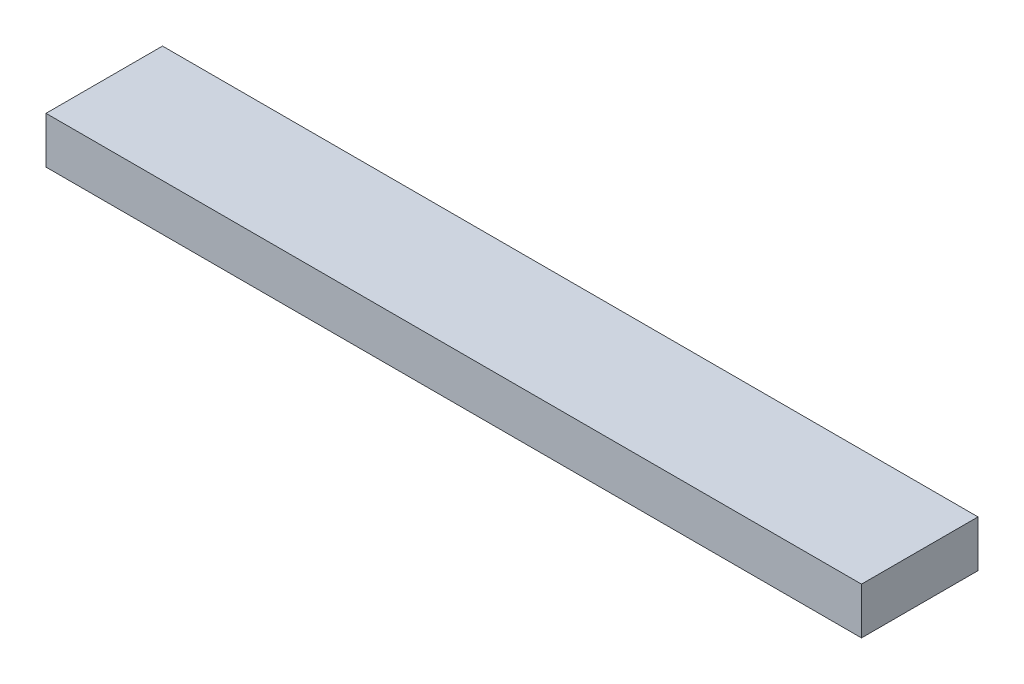
ISO-10303-21;
HEADER;
FILE_DESCRIPTION(('STEP AP214'),'2;1');
FILE_NAME('part.step','',(''),(''),'','','');
FILE_SCHEMA(('AUTOMOTIVE_DESIGN { 1 0 10303 214 1 1 1 1 }'));
ENDSEC;
DATA;
#1=APPLICATION_CONTEXT('core data for automotive mechanical design processes');
#2=APPLICATION_PROTOCOL_DEFINITION('international standard','automotive_design',2000,#1);
#3=PRODUCT_CONTEXT('',#1,'mechanical');
#4=PRODUCT('Part','Part','',(#3));
#5=PRODUCT_RELATED_PRODUCT_CATEGORY('part','',(#4));
#6=PRODUCT_DEFINITION_FORMATION('','',#4);
#7=PRODUCT_DEFINITION_CONTEXT('part definition',#1,'design');
#8=PRODUCT_DEFINITION('design','',#6,#7);
#9=PRODUCT_DEFINITION_SHAPE('','',#8);
#10=(LENGTH_UNIT() NAMED_UNIT(*) SI_UNIT(.MILLI.,.METRE.));
#11=(NAMED_UNIT(*) PLANE_ANGLE_UNIT() SI_UNIT($,.RADIAN.));
#12=(NAMED_UNIT(*) SI_UNIT($,.STERADIAN.) SOLID_ANGLE_UNIT());
#13=UNCERTAINTY_MEASURE_WITH_UNIT(LENGTH_MEASURE(1.E-05),#10,'distance_accuracy_value','');
#14=(GEOMETRIC_REPRESENTATION_CONTEXT(3) GLOBAL_UNCERTAINTY_ASSIGNED_CONTEXT((#13)) GLOBAL_UNIT_ASSIGNED_CONTEXT((#10,
#11,#12)) REPRESENTATION_CONTEXT('',''));
#15=CARTESIAN_POINT('',(0.,0.,0.));
#16=DIRECTION('',(0.,0.,1.));
#17=DIRECTION('',(1.,0.,0.));
#18=AXIS2_PLACEMENT_3D('',#15,#16,#17);
#19=CARTESIAN_POINT('',(175.,10.,-25.));
#20=DIRECTION('',(-1.,0.,0.));
#21=DIRECTION('',(0.,0.,1.));
#22=AXIS2_PLACEMENT_3D('',#19,#20,#21);
#23=PLANE('',#22);
#24=DIRECTION('',(0.,0.,-1.));
#25=VECTOR('',#24,1.);
#26=CARTESIAN_POINT('',(175.,-10.,-25.));
#27=LINE('',#26,#25);
#28=CARTESIAN_POINT('',(175.,-10.,25.));
#29=VERTEX_POINT('',#28);
#30=CARTESIAN_POINT('',(175.,-10.,-25.));
#31=VERTEX_POINT('',#30);
#32=EDGE_CURVE('E107',#29,#31,#27,.T.);
#33=ORIENTED_EDGE('',*,*,#32,.T.);
#34=DIRECTION('',(0.,-1.,0.));
#35=VECTOR('',#34,1.);
#36=CARTESIAN_POINT('',(175.,10.,-25.));
#37=LINE('',#36,#35);
#38=CARTESIAN_POINT('',(175.,10.,-25.));
#39=VERTEX_POINT('',#38);
#40=EDGE_CURVE('E11',#39,#31,#37,.T.);
#41=ORIENTED_EDGE('',*,*,#40,.F.);
#42=DIRECTION('',(0.,0.,-1.));
#43=VECTOR('',#42,1.);
#44=CARTESIAN_POINT('',(175.,10.,-25.));
#45=LINE('',#44,#43);
#46=CARTESIAN_POINT('',(175.,10.,25.));
#47=VERTEX_POINT('',#46);
#48=EDGE_CURVE('E91',#47,#39,#45,.T.);
#49=ORIENTED_EDGE('',*,*,#48,.F.);
#50=DIRECTION('',(0.,-1.,0.));
#51=VECTOR('',#50,1.);
#52=CARTESIAN_POINT('',(175.,10.,25.));
#53=LINE('',#52,#51);
#54=EDGE_CURVE('E103',#47,#29,#53,.T.);
#55=ORIENTED_EDGE('',*,*,#54,.T.);
#56=EDGE_LOOP('',(#33,#41,#49,#55));
#57=FACE_BOUND('',#56,.T.);
#58=ADVANCED_FACE('F39',(#57),#23,.F.);
#59=CARTESIAN_POINT('',(-175.,10.,-25.));
#60=DIRECTION('',(0.,0.,1.));
#61=DIRECTION('',(1.,0.,0.));
#62=AXIS2_PLACEMENT_3D('',#59,#60,#61);
#63=PLANE('',#62);
#64=DIRECTION('',(-1.,0.,0.));
#65=VECTOR('',#64,1.);
#66=CARTESIAN_POINT('',(-175.,-10.,-25.));
#67=LINE('',#66,#65);
#68=CARTESIAN_POINT('',(-175.,-10.,-25.));
#69=VERTEX_POINT('',#68);
#70=EDGE_CURVE('E96',#31,#69,#67,.T.);
#71=ORIENTED_EDGE('',*,*,#70,.T.);
#72=DIRECTION('',(0.,-1.,0.));
#73=VECTOR('',#72,1.);
#74=CARTESIAN_POINT('',(-175.,10.,-25.));
#75=LINE('',#74,#73);
#76=CARTESIAN_POINT('',(-175.,10.,-25.));
#77=VERTEX_POINT('',#76);
#78=EDGE_CURVE('E48',#77,#69,#75,.T.);
#79=ORIENTED_EDGE('',*,*,#78,.F.);
#80=DIRECTION('',(-1.,0.,0.));
#81=VECTOR('',#80,1.);
#82=CARTESIAN_POINT('',(-175.,10.,-25.));
#83=LINE('',#82,#81);
#84=EDGE_CURVE('E86',#39,#77,#83,.T.);
#85=ORIENTED_EDGE('',*,*,#84,.F.);
#86=ORIENTED_EDGE('',*,*,#40,.T.);
#87=EDGE_LOOP('',(#71,#79,#85,#86));
#88=FACE_BOUND('',#87,.T.);
#89=ADVANCED_FACE('F95',(#88),#63,.F.);
#90=CARTESIAN_POINT('',(-175.,10.,-25.));
#91=DIRECTION('',(1.,0.,0.));
#92=DIRECTION('',(0.,0.,-1.));
#93=AXIS2_PLACEMENT_3D('',#90,#91,#92);
#94=PLANE('',#93);
#95=DIRECTION('',(0.,0.,1.));
#96=VECTOR('',#95,1.);
#97=CARTESIAN_POINT('',(-175.,-10.,-25.));
#98=LINE('',#97,#96);
#99=CARTESIAN_POINT('',(-175.,-10.,25.));
#100=VERTEX_POINT('',#99);
#101=EDGE_CURVE('E73',#69,#100,#98,.T.);
#102=ORIENTED_EDGE('',*,*,#101,.T.);
#103=DIRECTION('',(0.,-1.,0.));
#104=VECTOR('',#103,1.);
#105=CARTESIAN_POINT('',(-175.,10.,25.));
#106=LINE('',#105,#104);
#107=CARTESIAN_POINT('',(-175.,10.,25.));
#108=VERTEX_POINT('',#107);
#109=EDGE_CURVE('E98',#108,#100,#106,.T.);
#110=ORIENTED_EDGE('',*,*,#109,.F.);
#111=DIRECTION('',(0.,0.,1.));
#112=VECTOR('',#111,1.);
#113=CARTESIAN_POINT('',(-175.,10.,-25.));
#114=LINE('',#113,#112);
#115=EDGE_CURVE('E89',#77,#108,#114,.T.);
#116=ORIENTED_EDGE('',*,*,#115,.F.);
#117=ORIENTED_EDGE('',*,*,#78,.T.);
#118=EDGE_LOOP('',(#102,#110,#116,#117));
#119=FACE_BOUND('',#118,.T.);
#120=ADVANCED_FACE('F99',(#119),#94,.F.);
#121=CARTESIAN_POINT('',(-175.,10.,25.));
#122=DIRECTION('',(0.,0.,-1.));
#123=DIRECTION('',(-1.,0.,0.));
#124=AXIS2_PLACEMENT_3D('',#121,#122,#123);
#125=PLANE('',#124);
#126=DIRECTION('',(1.,0.,0.));
#127=VECTOR('',#126,1.);
#128=CARTESIAN_POINT('',(-175.,-10.,25.));
#129=LINE('',#128,#127);
#130=EDGE_CURVE('E79',#100,#29,#129,.T.);
#131=ORIENTED_EDGE('',*,*,#130,.T.);
#132=ORIENTED_EDGE('',*,*,#54,.F.);
#133=DIRECTION('',(1.,0.,0.));
#134=VECTOR('',#133,1.);
#135=CARTESIAN_POINT('',(-175.,10.,25.));
#136=LINE('',#135,#134);
#137=EDGE_CURVE('E56',#108,#47,#136,.T.);
#138=ORIENTED_EDGE('',*,*,#137,.F.);
#139=ORIENTED_EDGE('',*,*,#109,.T.);
#140=EDGE_LOOP('',(#131,#132,#138,#139));
#141=FACE_BOUND('',#140,.T.);
#142=ADVANCED_FACE('F120',(#141),#125,.F.);
#143=CARTESIAN_POINT('',(0.,10.,0.));
#144=DIRECTION('',(0.,1.,0.));
#145=DIRECTION('',(0.,0.,1.));
#146=AXIS2_PLACEMENT_3D('',#143,#144,#145);
#147=PLANE('',#146);
#148=ORIENTED_EDGE('',*,*,#48,.T.);
#149=ORIENTED_EDGE('',*,*,#84,.T.);
#150=ORIENTED_EDGE('',*,*,#115,.T.);
#151=ORIENTED_EDGE('',*,*,#137,.T.);
#152=EDGE_LOOP('',(#148,#149,#150,#151));
#153=FACE_BOUND('',#152,.T.);
#154=ADVANCED_FACE('F87',(#153),#147,.T.);
#155=CARTESIAN_POINT('',(0.,-10.,0.));
#156=DIRECTION('',(0.,1.,0.));
#157=DIRECTION('',(0.,0.,1.));
#158=AXIS2_PLACEMENT_3D('',#155,#156,#157);
#159=PLANE('',#158);
#160=ORIENTED_EDGE('',*,*,#32,.F.);
#161=ORIENTED_EDGE('',*,*,#130,.F.);
#162=ORIENTED_EDGE('',*,*,#101,.F.);
#163=ORIENTED_EDGE('',*,*,#70,.F.);
#164=EDGE_LOOP('',(#160,#161,#162,#163));
#165=FACE_BOUND('',#164,.T.);
#166=ADVANCED_FACE('F123',(#165),#159,.F.);
#167=CLOSED_SHELL('',(#58,#89,#120,#142,#154,#166));
#168=MANIFOLD_SOLID_BREP('B2',#167);
#169=ADVANCED_BREP_SHAPE_REPRESENTATION('',(#18,#168),#14);
#170=SHAPE_DEFINITION_REPRESENTATION(#9,#169);
ENDSEC;
END-ISO-10303-21;
